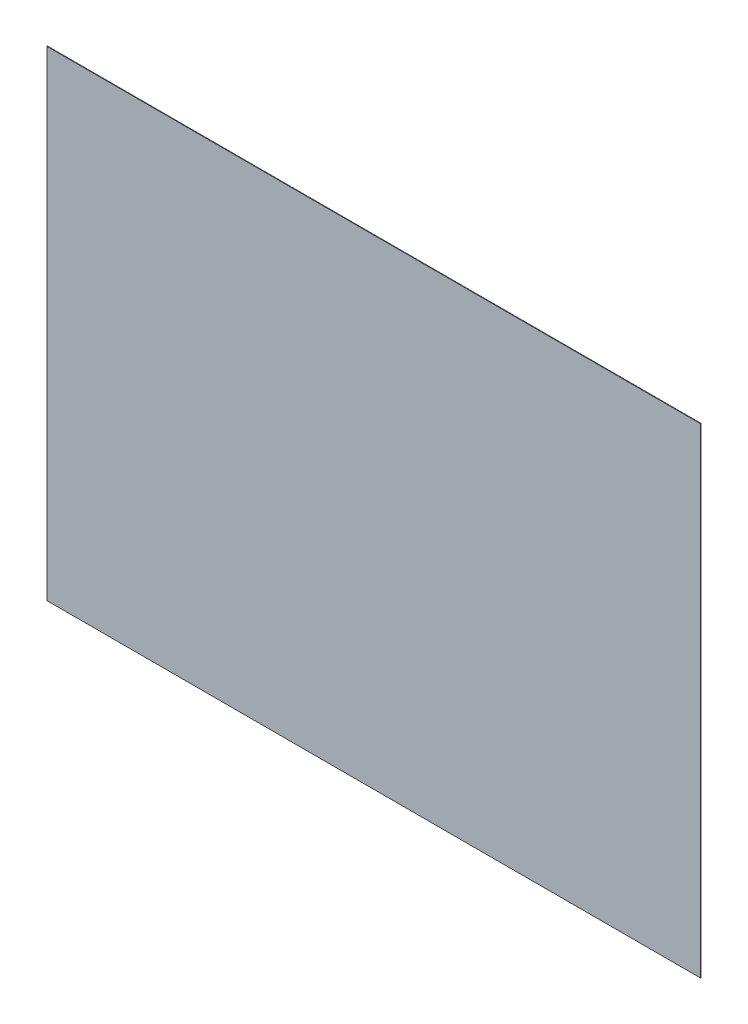
ISO-10303-21;
HEADER;
FILE_DESCRIPTION(('STEP AP214'),'2;1');
FILE_NAME('part.step','',(''),(''),'','','');
FILE_SCHEMA(('AUTOMOTIVE_DESIGN { 1 0 10303 214 1 1 1 1 }'));
ENDSEC;
DATA;
#1=APPLICATION_CONTEXT('core data for automotive mechanical design processes');
#2=APPLICATION_PROTOCOL_DEFINITION('international standard','automotive_design',2000,#1);
#3=PRODUCT_CONTEXT('',#1,'mechanical');
#4=PRODUCT('Part','Part','',(#3));
#5=PRODUCT_RELATED_PRODUCT_CATEGORY('part','',(#4));
#6=PRODUCT_DEFINITION_FORMATION('','',#4);
#7=PRODUCT_DEFINITION_CONTEXT('part definition',#1,'design');
#8=PRODUCT_DEFINITION('design','',#6,#7);
#9=PRODUCT_DEFINITION_SHAPE('','',#8);
#10=(LENGTH_UNIT() NAMED_UNIT(*) SI_UNIT(.MILLI.,.METRE.));
#11=(NAMED_UNIT(*) PLANE_ANGLE_UNIT() SI_UNIT($,.RADIAN.));
#12=(NAMED_UNIT(*) SI_UNIT($,.STERADIAN.) SOLID_ANGLE_UNIT());
#13=UNCERTAINTY_MEASURE_WITH_UNIT(LENGTH_MEASURE(1.E-05),#10,'distance_accuracy_value','');
#14=(GEOMETRIC_REPRESENTATION_CONTEXT(3) GLOBAL_UNCERTAINTY_ASSIGNED_CONTEXT((#13)) GLOBAL_UNIT_ASSIGNED_CONTEXT((#10,
#11,#12)) REPRESENTATION_CONTEXT('',''));
#15=CARTESIAN_POINT('',(0.,0.,0.));
#16=DIRECTION('',(0.,0.,1.));
#17=DIRECTION('',(1.,0.,0.));
#18=AXIS2_PLACEMENT_3D('',#15,#16,#17);
#19=CARTESIAN_POINT('',(28.8,-21.15,0.05));
#20=DIRECTION('',(-1.,0.,0.));
#21=DIRECTION('',(0.,0.,1.));
#22=AXIS2_PLACEMENT_3D('',#19,#20,#21);
#23=PLANE('',#22);
#24=DIRECTION('',(0.,1.,0.));
#25=VECTOR('',#24,1.);
#26=CARTESIAN_POINT('',(28.8,-21.15,0.));
#27=LINE('',#26,#25);
#28=CARTESIAN_POINT('',(28.8,-21.15,0.));
#29=VERTEX_POINT('',#28);
#30=CARTESIAN_POINT('',(28.8,21.15,0.));
#31=VERTEX_POINT('',#30);
#32=EDGE_CURVE('E96',#29,#31,#27,.T.);
#33=ORIENTED_EDGE('',*,*,#32,.T.);
#34=DIRECTION('',(0.,0.,-1.));
#35=VECTOR('',#34,1.);
#36=CARTESIAN_POINT('',(28.8,21.15,0.05));
#37=LINE('',#36,#35);
#38=CARTESIAN_POINT('',(28.8,21.15,0.05));
#39=VERTEX_POINT('',#38);
#40=EDGE_CURVE('E11',#39,#31,#37,.T.);
#41=ORIENTED_EDGE('',*,*,#40,.F.);
#42=DIRECTION('',(0.,1.,0.));
#43=VECTOR('',#42,1.);
#44=CARTESIAN_POINT('',(28.8,-21.15,0.05));
#45=LINE('',#44,#43);
#46=CARTESIAN_POINT('',(28.8,-21.15,0.05));
#47=VERTEX_POINT('',#46);
#48=EDGE_CURVE('E84',#47,#39,#45,.T.);
#49=ORIENTED_EDGE('',*,*,#48,.F.);
#50=DIRECTION('',(0.,0.,-1.));
#51=VECTOR('',#50,1.);
#52=CARTESIAN_POINT('',(28.8,-21.15,0.05));
#53=LINE('',#52,#51);
#54=EDGE_CURVE('E92',#47,#29,#53,.T.);
#55=ORIENTED_EDGE('',*,*,#54,.T.);
#56=EDGE_LOOP('',(#33,#41,#49,#55));
#57=FACE_BOUND('',#56,.T.);
#58=ADVANCED_FACE('F33',(#57),#23,.F.);
#59=CARTESIAN_POINT('',(-28.8,21.15,0.05));
#60=DIRECTION('',(0.,-1.,0.));
#61=DIRECTION('',(0.,0.,-1.));
#62=AXIS2_PLACEMENT_3D('',#59,#60,#61);
#63=PLANE('',#62);
#64=DIRECTION('',(-1.,0.,0.));
#65=VECTOR('',#64,1.);
#66=CARTESIAN_POINT('',(-28.8,21.15,0.));
#67=LINE('',#66,#65);
#68=CARTESIAN_POINT('',(-28.8,21.15,0.));
#69=VERTEX_POINT('',#68);
#70=EDGE_CURVE('E88',#31,#69,#67,.T.);
#71=ORIENTED_EDGE('',*,*,#70,.T.);
#72=DIRECTION('',(0.,0.,-1.));
#73=VECTOR('',#72,1.);
#74=CARTESIAN_POINT('',(-28.8,21.15,0.05));
#75=LINE('',#74,#73);
#76=CARTESIAN_POINT('',(-28.8,21.15,0.05));
#77=VERTEX_POINT('',#76);
#78=EDGE_CURVE('E41',#77,#69,#75,.T.);
#79=ORIENTED_EDGE('',*,*,#78,.F.);
#80=DIRECTION('',(-1.,0.,0.));
#81=VECTOR('',#80,1.);
#82=CARTESIAN_POINT('',(-28.8,21.15,0.05));
#83=LINE('',#82,#81);
#84=EDGE_CURVE('E79',#39,#77,#83,.T.);
#85=ORIENTED_EDGE('',*,*,#84,.F.);
#86=ORIENTED_EDGE('',*,*,#40,.T.);
#87=EDGE_LOOP('',(#71,#79,#85,#86));
#88=FACE_BOUND('',#87,.T.);
#89=ADVANCED_FACE('F87',(#88),#63,.F.);
#90=CARTESIAN_POINT('',(-28.8,-21.15,0.05));
#91=DIRECTION('',(1.,0.,0.));
#92=DIRECTION('',(0.,0.,-1.));
#93=AXIS2_PLACEMENT_3D('',#90,#91,#92);
#94=PLANE('',#93);
#95=DIRECTION('',(0.,-1.,0.));
#96=VECTOR('',#95,1.);
#97=CARTESIAN_POINT('',(-28.8,-21.15,0.));
#98=LINE('',#97,#96);
#99=CARTESIAN_POINT('',(-28.8,-21.15,0.));
#100=VERTEX_POINT('',#99);
#101=EDGE_CURVE('E66',#69,#100,#98,.T.);
#102=ORIENTED_EDGE('',*,*,#101,.T.);
#103=DIRECTION('',(0.,0.,-1.));
#104=VECTOR('',#103,1.);
#105=CARTESIAN_POINT('',(-28.8,-21.15,0.05));
#106=LINE('',#105,#104);
#107=CARTESIAN_POINT('',(-28.8,-21.15,0.05));
#108=VERTEX_POINT('',#107);
#109=EDGE_CURVE('E89',#108,#100,#106,.T.);
#110=ORIENTED_EDGE('',*,*,#109,.F.);
#111=DIRECTION('',(0.,-1.,0.));
#112=VECTOR('',#111,1.);
#113=CARTESIAN_POINT('',(-28.8,-21.15,0.05));
#114=LINE('',#113,#112);
#115=EDGE_CURVE('E82',#77,#108,#114,.T.);
#116=ORIENTED_EDGE('',*,*,#115,.F.);
#117=ORIENTED_EDGE('',*,*,#78,.T.);
#118=EDGE_LOOP('',(#102,#110,#116,#117));
#119=FACE_BOUND('',#118,.T.);
#120=ADVANCED_FACE('F90',(#119),#94,.F.);
#121=CARTESIAN_POINT('',(-28.8,-21.15,0.05));
#122=DIRECTION('',(0.,1.,0.));
#123=DIRECTION('',(0.,0.,1.));
#124=AXIS2_PLACEMENT_3D('',#121,#122,#123);
#125=PLANE('',#124);
#126=DIRECTION('',(1.,0.,0.));
#127=VECTOR('',#126,1.);
#128=CARTESIAN_POINT('',(-28.8,-21.15,0.));
#129=LINE('',#128,#127);
#130=EDGE_CURVE('E72',#100,#29,#129,.T.);
#131=ORIENTED_EDGE('',*,*,#130,.T.);
#132=ORIENTED_EDGE('',*,*,#54,.F.);
#133=DIRECTION('',(1.,0.,0.));
#134=VECTOR('',#133,1.);
#135=CARTESIAN_POINT('',(-28.8,-21.15,0.05));
#136=LINE('',#135,#134);
#137=EDGE_CURVE('E49',#108,#47,#136,.T.);
#138=ORIENTED_EDGE('',*,*,#137,.F.);
#139=ORIENTED_EDGE('',*,*,#109,.T.);
#140=EDGE_LOOP('',(#131,#132,#138,#139));
#141=FACE_BOUND('',#140,.T.);
#142=ADVANCED_FACE('F103',(#141),#125,.F.);
#143=CARTESIAN_POINT('',(0.,0.,0.05));
#144=DIRECTION('',(0.,0.,-1.));
#145=DIRECTION('',(-1.,0.,0.));
#146=AXIS2_PLACEMENT_3D('',#143,#144,#145);
#147=PLANE('',#146);
#148=ORIENTED_EDGE('',*,*,#48,.T.);
#149=ORIENTED_EDGE('',*,*,#84,.T.);
#150=ORIENTED_EDGE('',*,*,#115,.T.);
#151=ORIENTED_EDGE('',*,*,#137,.T.);
#152=EDGE_LOOP('',(#148,#149,#150,#151));
#153=FACE_BOUND('',#152,.T.);
#154=ADVANCED_FACE('F80',(#153),#147,.F.);
#155=CARTESIAN_POINT('',(0.,0.,0.));
#156=DIRECTION('',(0.,0.,-1.));
#157=DIRECTION('',(-1.,0.,0.));
#158=AXIS2_PLACEMENT_3D('',#155,#156,#157);
#159=PLANE('',#158);
#160=ORIENTED_EDGE('',*,*,#32,.F.);
#161=ORIENTED_EDGE('',*,*,#130,.F.);
#162=ORIENTED_EDGE('',*,*,#101,.F.);
#163=ORIENTED_EDGE('',*,*,#70,.F.);
#164=EDGE_LOOP('',(#160,#161,#162,#163));
#165=FACE_BOUND('',#164,.T.);
#166=ADVANCED_FACE('F106',(#165),#159,.T.);
#167=CLOSED_SHELL('',(#58,#89,#120,#142,#154,#166));
#168=MANIFOLD_SOLID_BREP('B2',#167);
#169=ADVANCED_BREP_SHAPE_REPRESENTATION('',(#18,#168),#14);
#170=SHAPE_DEFINITION_REPRESENTATION(#9,#169);
ENDSEC;
END-ISO-10303-21;
